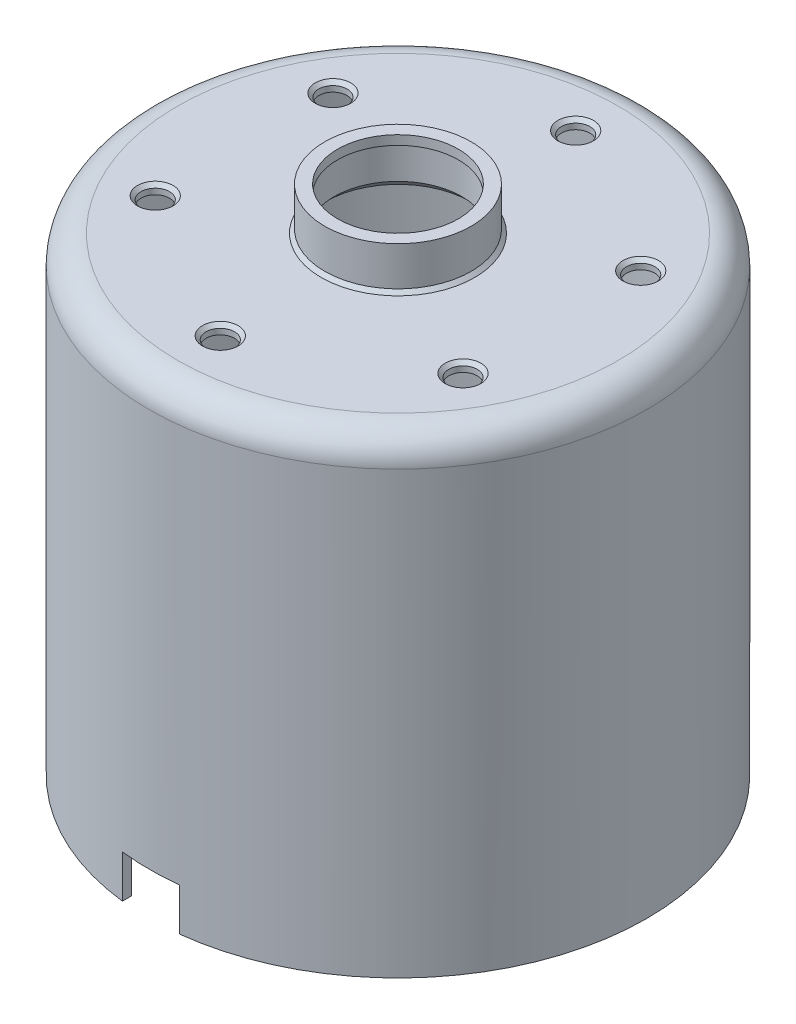
ISO-10303-21;
HEADER;
FILE_DESCRIPTION(('STEP AP214'),'2;1');
FILE_NAME('part.step','',(''),(''),'','','');
FILE_SCHEMA(('AUTOMOTIVE_DESIGN { 1 0 10303 214 1 1 1 1 }'));
ENDSEC;
DATA;
#1=APPLICATION_CONTEXT('core data for automotive mechanical design processes');
#2=APPLICATION_PROTOCOL_DEFINITION('international standard','automotive_design',2000,#1);
#3=PRODUCT_CONTEXT('',#1,'mechanical');
#4=PRODUCT('Part','Part','',(#3));
#5=PRODUCT_RELATED_PRODUCT_CATEGORY('part','',(#4));
#6=PRODUCT_DEFINITION_FORMATION('','',#4);
#7=PRODUCT_DEFINITION_CONTEXT('part definition',#1,'design');
#8=PRODUCT_DEFINITION('design','',#6,#7);
#9=PRODUCT_DEFINITION_SHAPE('','',#8);
#10=(LENGTH_UNIT() NAMED_UNIT(*) SI_UNIT(.MILLI.,.METRE.));
#11=(NAMED_UNIT(*) PLANE_ANGLE_UNIT() SI_UNIT($,.RADIAN.));
#12=(NAMED_UNIT(*) SI_UNIT($,.STERADIAN.) SOLID_ANGLE_UNIT());
#13=UNCERTAINTY_MEASURE_WITH_UNIT(LENGTH_MEASURE(1.E-05),#10,'distance_accuracy_value','');
#14=(GEOMETRIC_REPRESENTATION_CONTEXT(3) GLOBAL_UNCERTAINTY_ASSIGNED_CONTEXT((#13)) GLOBAL_UNIT_ASSIGNED_CONTEXT((#10,
#11,#12)) REPRESENTATION_CONTEXT('',''));
#15=CARTESIAN_POINT('',(0.,0.,0.));
#16=DIRECTION('',(0.,0.,1.));
#17=DIRECTION('',(1.,0.,0.));
#18=AXIS2_PLACEMENT_3D('',#15,#16,#17);
#19=CARTESIAN_POINT('',(0.,33.,0.));
#20=DIRECTION('',(0.,-1.,0.));
#21=DIRECTION('',(0.,0.,-1.));
#22=AXIS2_PLACEMENT_3D('',#19,#20,#21);
#23=CYLINDRICAL_SURFACE('',#22,17.5);
#24=CARTESIAN_POINT('',(0.,31.,0.));
#25=DIRECTION('',(0.,1.,0.));
#26=DIRECTION('',(0.,0.,1.));
#27=AXIS2_PLACEMENT_3D('',#24,#25,#26);
#28=CIRCLE('',#27,17.5);
#29=CARTESIAN_POINT('',(0.,31.,17.5));
#30=VERTEX_POINT('',#29);
#31=EDGE_CURVE('E128',#30,#30,#28,.F.);
#32=ORIENTED_EDGE('',*,*,#31,.T.);
#33=EDGE_LOOP('',(#32));
#34=FACE_BOUND('',#33,.T.);
#35=CARTESIAN_POINT('',(0.,0.,0.));
#36=DIRECTION('',(0.,1.,0.));
#37=DIRECTION('',(0.,0.,1.));
#38=AXIS2_PLACEMENT_3D('',#35,#36,#37);
#39=CIRCLE('',#38,17.5);
#40=CARTESIAN_POINT('',(2.,0.,17.3853386507137));
#41=VERTEX_POINT('',#40);
#42=CARTESIAN_POINT('',(-2.,0.,17.3853386507137));
#43=VERTEX_POINT('',#42);
#44=EDGE_CURVE('E94',#41,#43,#39,.T.);
#45=ORIENTED_EDGE('',*,*,#44,.T.);
#46=DIRECTION('',(0.,-1.,0.));
#47=VECTOR('',#46,1.);
#48=CARTESIAN_POINT('',(-2.,33.,17.3853386507137));
#49=LINE('',#48,#47);
#50=CARTESIAN_POINT('',(-2.,3.,17.3853386507137));
#51=VERTEX_POINT('',#50);
#52=EDGE_CURVE('E553',#51,#43,#49,.T.);
#53=ORIENTED_EDGE('',*,*,#52,.F.);
#54=CARTESIAN_POINT('',(0.,3.,0.));
#55=DIRECTION('',(0.,1.,0.));
#56=DIRECTION('',(0.,0.,1.));
#57=AXIS2_PLACEMENT_3D('',#54,#55,#56);
#58=CIRCLE('',#57,17.5);
#59=CARTESIAN_POINT('',(2.,3.,17.3853386507137));
#60=VERTEX_POINT('',#59);
#61=EDGE_CURVE('E556',#60,#51,#58,.F.);
#62=ORIENTED_EDGE('',*,*,#61,.F.);
#63=DIRECTION('',(0.,-1.,0.));
#64=VECTOR('',#63,1.);
#65=CARTESIAN_POINT('',(2.,33.,17.3853386507137));
#66=LINE('',#65,#64);
#67=EDGE_CURVE('E96',#41,#60,#66,.F.);
#68=ORIENTED_EDGE('',*,*,#67,.F.);
#69=EDGE_LOOP('',(#45,#53,#62,#68));
#70=FACE_BOUND('',#69,.T.);
#71=ADVANCED_FACE('F36',(#34,#70),#23,.T.);
#72=CARTESIAN_POINT('',(0.,33.,0.));
#73=DIRECTION('',(0.,1.,0.));
#74=DIRECTION('',(0.,0.,1.));
#75=AXIS2_PLACEMENT_3D('',#72,#73,#74);
#76=PLANE('',#75);
#77=CARTESIAN_POINT('',(10.8253175473054,33.,-6.25000000000013));
#78=DIRECTION('',(0.,1.,0.));
#79=DIRECTION('',(0.,0.,1.));
#80=AXIS2_PLACEMENT_3D('',#77,#78,#79);
#81=CIRCLE('',#80,1.25);
#82=CARTESIAN_POINT('',(10.8253175473054,33.,-5.00000000000013));
#83=VERTEX_POINT('',#82);
#84=EDGE_CURVE('E11',#83,#83,#81,.F.);
#85=ORIENTED_EDGE('',*,*,#84,.T.);
#86=EDGE_LOOP('',(#85));
#87=FACE_BOUND('',#86,.T.);
#88=CARTESIAN_POINT('',(10.8253175473055,33.,6.2499999999999));
#89=DIRECTION('',(0.,1.,0.));
#90=DIRECTION('',(0.,0.,1.));
#91=AXIS2_PLACEMENT_3D('',#88,#89,#90);
#92=CIRCLE('',#91,1.25000000000002);
#93=CARTESIAN_POINT('',(10.8253175473055,33.,7.49999999999992));
#94=VERTEX_POINT('',#93);
#95=EDGE_CURVE('E174',#94,#94,#92,.F.);
#96=ORIENTED_EDGE('',*,*,#95,.T.);
#97=EDGE_LOOP('',(#96));
#98=FACE_BOUND('',#97,.T.);
#99=CARTESIAN_POINT('',(0.,33.,12.5));
#100=DIRECTION('',(0.,1.,0.));
#101=DIRECTION('',(0.,0.,1.));
#102=AXIS2_PLACEMENT_3D('',#99,#100,#101);
#103=CIRCLE('',#102,1.24999999999999);
#104=CARTESIAN_POINT('',(0.,33.,13.75));
#105=VERTEX_POINT('',#104);
#106=EDGE_CURVE('E166',#105,#105,#103,.F.);
#107=ORIENTED_EDGE('',*,*,#106,.T.);
#108=EDGE_LOOP('',(#107));
#109=FACE_BOUND('',#108,.T.);
#110=CARTESIAN_POINT('',(-10.8253175473055,33.,6.25000000000005));
#111=DIRECTION('',(0.,1.,0.));
#112=DIRECTION('',(0.,0.,1.));
#113=AXIS2_PLACEMENT_3D('',#110,#111,#112);
#114=CIRCLE('',#113,1.25);
#115=CARTESIAN_POINT('',(-10.8253175473055,33.,7.50000000000005));
#116=VERTEX_POINT('',#115);
#117=EDGE_CURVE('E159',#116,#116,#114,.F.);
#118=ORIENTED_EDGE('',*,*,#117,.T.);
#119=EDGE_LOOP('',(#118));
#120=FACE_BOUND('',#119,.T.);
#121=CARTESIAN_POINT('',(-10.8253175473055,33.,-6.24999999999998));
#122=DIRECTION('',(0.,1.,0.));
#123=DIRECTION('',(0.,0.,1.));
#124=AXIS2_PLACEMENT_3D('',#121,#122,#123);
#125=CIRCLE('',#124,1.25000000000002);
#126=CARTESIAN_POINT('',(-10.8253175473055,33.,-4.99999999999996));
#127=VERTEX_POINT('',#126);
#128=EDGE_CURVE('E151',#127,#127,#125,.F.);
#129=ORIENTED_EDGE('',*,*,#128,.T.);
#130=EDGE_LOOP('',(#129));
#131=FACE_BOUND('',#130,.T.);
#132=CARTESIAN_POINT('',(0.,33.,-12.5));
#133=DIRECTION('',(0.,1.,0.));
#134=DIRECTION('',(0.,0.,1.));
#135=AXIS2_PLACEMENT_3D('',#132,#133,#134);
#136=CIRCLE('',#135,1.24999999999999);
#137=CARTESIAN_POINT('',(0.,33.,-11.25));
#138=VERTEX_POINT('',#137);
#139=EDGE_CURVE('E143',#138,#138,#136,.F.);
#140=ORIENTED_EDGE('',*,*,#139,.T.);
#141=EDGE_LOOP('',(#140));
#142=FACE_BOUND('',#141,.T.);
#143=CARTESIAN_POINT('',(0.,33.,0.));
#144=DIRECTION('',(0.,1.,0.));
#145=DIRECTION('',(0.,0.,1.));
#146=AXIS2_PLACEMENT_3D('',#143,#144,#145);
#147=CIRCLE('',#146,5.40000000000001);
#148=CARTESIAN_POINT('',(0.,33.,5.40000000000001));
#149=VERTEX_POINT('',#148);
#150=EDGE_CURVE('E135',#149,#149,#147,.F.);
#151=ORIENTED_EDGE('',*,*,#150,.T.);
#152=EDGE_LOOP('',(#151));
#153=FACE_BOUND('',#152,.T.);
#154=CARTESIAN_POINT('',(0.,33.,0.));
#155=DIRECTION('',(0.,1.,0.));
#156=DIRECTION('',(0.,0.,1.));
#157=AXIS2_PLACEMENT_3D('',#154,#155,#156);
#158=CIRCLE('',#157,15.5);
#159=CARTESIAN_POINT('',(0.,33.,15.5));
#160=VERTEX_POINT('',#159);
#161=EDGE_CURVE('E124',#160,#160,#158,.T.);
#162=ORIENTED_EDGE('',*,*,#161,.T.);
#163=EDGE_LOOP('',(#162));
#164=FACE_BOUND('',#163,.T.);
#165=ADVANCED_FACE('F199',(#87,#98,#109,#120,#131,#142,#153,#164),#76,.T.);
#166=CARTESIAN_POINT('',(0.,0.,0.));
#167=DIRECTION('',(0.,1.,0.));
#168=DIRECTION('',(0.,0.,1.));
#169=AXIS2_PLACEMENT_3D('',#166,#167,#168);
#170=PLANE('',#169);
#171=CARTESIAN_POINT('',(0.,0.,0.));
#172=DIRECTION('',(0.,1.,0.));
#173=DIRECTION('',(0.,0.,1.));
#174=AXIS2_PLACEMENT_3D('',#171,#172,#173);
#175=CIRCLE('',#174,16.85);
#176=CARTESIAN_POINT('',(2.,0.,16.7308846149867));
#177=VERTEX_POINT('',#176);
#178=CARTESIAN_POINT('',(-2.,0.,16.7308846149867));
#179=VERTEX_POINT('',#178);
#180=EDGE_CURVE('E92',#177,#179,#175,.T.);
#181=ORIENTED_EDGE('',*,*,#180,.T.);
#182=DIRECTION('',(0.,0.,-1.));
#183=VECTOR('',#182,1.);
#184=CARTESIAN_POINT('',(-2.,0.,-17.501));
#185=LINE('',#184,#183);
#186=EDGE_CURVE('E97',#43,#179,#185,.T.);
#187=ORIENTED_EDGE('',*,*,#186,.F.);
#188=ORIENTED_EDGE('',*,*,#44,.F.);
#189=DIRECTION('',(0.,0.,1.));
#190=VECTOR('',#189,1.);
#191=CARTESIAN_POINT('',(2.,0.,-17.501));
#192=LINE('',#191,#190);
#193=EDGE_CURVE('E80',#177,#41,#192,.T.);
#194=ORIENTED_EDGE('',*,*,#193,.F.);
#195=EDGE_LOOP('',(#181,#187,#188,#194));
#196=FACE_BOUND('',#195,.T.);
#197=ADVANCED_FACE('F90',(#196),#170,.F.);
#198=CARTESIAN_POINT('',(0.,31.,0.));
#199=DIRECTION('',(0.,1.,0.));
#200=DIRECTION('',(0.,0.,1.));
#201=AXIS2_PLACEMENT_3D('',#198,#199,#200);
#202=TOROIDAL_SURFACE('',#201,15.5,2.);
#203=ORIENTED_EDGE('',*,*,#31,.F.);
#204=EDGE_LOOP('',(#203));
#205=FACE_BOUND('',#204,.T.);
#206=ORIENTED_EDGE('',*,*,#161,.F.);
#207=EDGE_LOOP('',(#206));
#208=FACE_BOUND('',#207,.T.);
#209=ADVANCED_FACE('F210',(#205,#208),#202,.T.);
#210=CARTESIAN_POINT('',(0.,36.,0.));
#211=DIRECTION('',(0.,-1.,0.));
#212=DIRECTION('',(0.,0.,-1.));
#213=AXIS2_PLACEMENT_3D('',#210,#211,#212);
#214=CYLINDRICAL_SURFACE('',#213,5.15);
#215=CARTESIAN_POINT('',(0.,33.25,0.));
#216=DIRECTION('',(0.,1.,0.));
#217=DIRECTION('',(0.,0.,1.));
#218=AXIS2_PLACEMENT_3D('',#215,#216,#217);
#219=CIRCLE('',#218,5.15);
#220=CARTESIAN_POINT('',(0.,33.25,5.15));
#221=VERTEX_POINT('',#220);
#222=EDGE_CURVE('E132',#221,#221,#219,.T.);
#223=ORIENTED_EDGE('',*,*,#222,.T.);
#224=EDGE_LOOP('',(#223));
#225=FACE_BOUND('',#224,.T.);
#226=CARTESIAN_POINT('',(0.,36.,0.));
#227=DIRECTION('',(0.,1.,0.));
#228=DIRECTION('',(0.,0.,1.));
#229=AXIS2_PLACEMENT_3D('',#226,#227,#228);
#230=CIRCLE('',#229,5.15);
#231=CARTESIAN_POINT('',(0.,36.,5.15));
#232=VERTEX_POINT('',#231);
#233=EDGE_CURVE('E117',#232,#232,#230,.T.);
#234=ORIENTED_EDGE('',*,*,#233,.F.);
#235=EDGE_LOOP('',(#234));
#236=FACE_BOUND('',#235,.T.);
#237=ADVANCED_FACE('F213',(#225,#236),#214,.T.);
#238=CARTESIAN_POINT('',(0.,36.,0.));
#239=DIRECTION('',(0.,1.,0.));
#240=DIRECTION('',(0.,0.,1.));
#241=AXIS2_PLACEMENT_3D('',#238,#239,#240);
#242=PLANE('',#241);
#243=CARTESIAN_POINT('',(0.,36.,0.));
#244=DIRECTION('',(0.,1.,0.));
#245=DIRECTION('',(0.,0.,1.));
#246=AXIS2_PLACEMENT_3D('',#243,#244,#245);
#247=CIRCLE('',#246,4.25);
#248=CARTESIAN_POINT('',(0.,36.,4.25));
#249=VERTEX_POINT('',#248);
#250=EDGE_CURVE('E278',#249,#249,#247,.T.);
#251=ORIENTED_EDGE('',*,*,#250,.F.);
#252=EDGE_LOOP('',(#251));
#253=FACE_BOUND('',#252,.T.);
#254=ORIENTED_EDGE('',*,*,#233,.T.);
#255=EDGE_LOOP('',(#254));
#256=FACE_BOUND('',#255,.T.);
#257=ADVANCED_FACE('F218',(#253,#256),#242,.T.);
#258=CARTESIAN_POINT('',(0.,33.25,0.));
#259=DIRECTION('',(0.,-1.,0.));
#260=DIRECTION('',(0.,0.,-1.));
#261=AXIS2_PLACEMENT_3D('',#258,#259,#260);
#262=CONICAL_SURFACE('',#261,5.15,0.785398163397436);
#263=ORIENTED_EDGE('',*,*,#150,.F.);
#264=EDGE_LOOP('',(#263));
#265=FACE_BOUND('',#264,.T.);
#266=ORIENTED_EDGE('',*,*,#222,.F.);
#267=EDGE_LOOP('',(#266));
#268=FACE_BOUND('',#267,.T.);
#269=ADVANCED_FACE('F215',(#265,#268),#262,.T.);
#270=CARTESIAN_POINT('',(0.,33.,0.));
#271=DIRECTION('',(0.,-1.,0.));
#272=DIRECTION('',(0.,0.,-1.));
#273=AXIS2_PLACEMENT_3D('',#270,#271,#272);
#274=CYLINDRICAL_SURFACE('',#273,16.85);
#275=DIRECTION('',(0.,-1.,0.));
#276=VECTOR('',#275,1.);
#277=CARTESIAN_POINT('',(-2.,33.,16.7308846149867));
#278=LINE('',#277,#276);
#279=CARTESIAN_POINT('',(-2.,3.,16.7308846149867));
#280=VERTEX_POINT('',#279);
#281=EDGE_CURVE('E60',#280,#179,#278,.T.);
#282=ORIENTED_EDGE('',*,*,#281,.T.);
#283=ORIENTED_EDGE('',*,*,#180,.F.);
#284=DIRECTION('',(0.,-1.,0.));
#285=VECTOR('',#284,1.);
#286=CARTESIAN_POINT('',(2.,33.,16.7308846149867));
#287=LINE('',#286,#285);
#288=CARTESIAN_POINT('',(2.,3.,16.7308846149867));
#289=VERTEX_POINT('',#288);
#290=EDGE_CURVE('E77',#177,#289,#287,.F.);
#291=ORIENTED_EDGE('',*,*,#290,.T.);
#292=CARTESIAN_POINT('',(0.,3.,0.));
#293=DIRECTION('',(0.,1.,0.));
#294=DIRECTION('',(0.,0.,1.));
#295=AXIS2_PLACEMENT_3D('',#292,#293,#294);
#296=CIRCLE('',#295,16.85);
#297=EDGE_CURVE('E270',#289,#280,#296,.F.);
#298=ORIENTED_EDGE('',*,*,#297,.T.);
#299=EDGE_LOOP('',(#282,#283,#291,#298));
#300=FACE_BOUND('',#299,.T.);
#301=CARTESIAN_POINT('',(0.,31.,0.));
#302=DIRECTION('',(0.,-1.,0.));
#303=DIRECTION('',(0.,0.,-1.));
#304=AXIS2_PLACEMENT_3D('',#301,#302,#303);
#305=CIRCLE('',#304,16.85);
#306=CARTESIAN_POINT('',(0.,31.,-16.85));
#307=VERTEX_POINT('',#306);
#308=EDGE_CURVE('E109',#307,#307,#305,.T.);
#309=ORIENTED_EDGE('',*,*,#308,.F.);
#310=EDGE_LOOP('',(#309));
#311=FACE_BOUND('',#310,.T.);
#312=ADVANCED_FACE('F99',(#300,#311),#274,.F.);
#313=CARTESIAN_POINT('',(0.,32.35,0.));
#314=DIRECTION('',(0.,1.,0.));
#315=DIRECTION('',(0.,0.,1.));
#316=AXIS2_PLACEMENT_3D('',#313,#314,#315);
#317=PLANE('',#316);
#318=CARTESIAN_POINT('',(10.8253175473054,32.35,-6.25000000000013));
#319=DIRECTION('',(0.,1.,0.));
#320=DIRECTION('',(0.,0.,1.));
#321=AXIS2_PLACEMENT_3D('',#318,#319,#320);
#322=CIRCLE('',#321,1.);
#323=CARTESIAN_POINT('',(10.8253175473054,32.35,-5.25000000000013));
#324=VERTEX_POINT('',#323);
#325=EDGE_CURVE('E263',#324,#324,#322,.F.);
#326=ORIENTED_EDGE('',*,*,#325,.F.);
#327=EDGE_LOOP('',(#326));
#328=FACE_BOUND('',#327,.T.);
#329=CARTESIAN_POINT('',(10.8253175473055,32.35,6.2499999999999));
#330=DIRECTION('',(0.,1.,0.));
#331=DIRECTION('',(0.,0.,1.));
#332=AXIS2_PLACEMENT_3D('',#329,#330,#331);
#333=CIRCLE('',#332,1.);
#334=CARTESIAN_POINT('',(10.8253175473055,32.35,7.2499999999999));
#335=VERTEX_POINT('',#334);
#336=EDGE_CURVE('E254',#335,#335,#333,.F.);
#337=ORIENTED_EDGE('',*,*,#336,.F.);
#338=EDGE_LOOP('',(#337));
#339=FACE_BOUND('',#338,.T.);
#340=CARTESIAN_POINT('',(0.,32.35,12.5));
#341=DIRECTION('',(0.,1.,0.));
#342=DIRECTION('',(0.,0.,1.));
#343=AXIS2_PLACEMENT_3D('',#340,#341,#342);
#344=CIRCLE('',#343,1.);
#345=CARTESIAN_POINT('',(0.,32.35,13.5));
#346=VERTEX_POINT('',#345);
#347=EDGE_CURVE('E250',#346,#346,#344,.F.);
#348=ORIENTED_EDGE('',*,*,#347,.F.);
#349=EDGE_LOOP('',(#348));
#350=FACE_BOUND('',#349,.T.);
#351=CARTESIAN_POINT('',(-10.8253175473055,32.35,6.25000000000005));
#352=DIRECTION('',(0.,1.,0.));
#353=DIRECTION('',(0.,0.,1.));
#354=AXIS2_PLACEMENT_3D('',#351,#352,#353);
#355=CIRCLE('',#354,1.);
#356=CARTESIAN_POINT('',(-10.8253175473055,32.35,7.25000000000005));
#357=VERTEX_POINT('',#356);
#358=EDGE_CURVE('E253',#357,#357,#355,.F.);
#359=ORIENTED_EDGE('',*,*,#358,.F.);
#360=EDGE_LOOP('',(#359));
#361=FACE_BOUND('',#360,.T.);
#362=CARTESIAN_POINT('',(-10.8253175473055,32.35,-6.24999999999998));
#363=DIRECTION('',(0.,1.,0.));
#364=DIRECTION('',(0.,0.,1.));
#365=AXIS2_PLACEMENT_3D('',#362,#363,#364);
#366=CIRCLE('',#365,1.);
#367=CARTESIAN_POINT('',(-10.8253175473055,32.35,-5.24999999999998));
#368=VERTEX_POINT('',#367);
#369=EDGE_CURVE('E259',#368,#368,#366,.F.);
#370=ORIENTED_EDGE('',*,*,#369,.F.);
#371=EDGE_LOOP('',(#370));
#372=FACE_BOUND('',#371,.T.);
#373=CARTESIAN_POINT('',(0.,32.35,-12.5));
#374=DIRECTION('',(0.,1.,0.));
#375=DIRECTION('',(0.,0.,1.));
#376=AXIS2_PLACEMENT_3D('',#373,#374,#375);
#377=CIRCLE('',#376,1.);
#378=CARTESIAN_POINT('',(0.,32.35,-11.5));
#379=VERTEX_POINT('',#378);
#380=EDGE_CURVE('E274',#379,#379,#377,.F.);
#381=ORIENTED_EDGE('',*,*,#380,.F.);
#382=EDGE_LOOP('',(#381));
#383=FACE_BOUND('',#382,.T.);
#384=CARTESIAN_POINT('',(0.,32.35,0.));
#385=DIRECTION('',(0.,1.,0.));
#386=DIRECTION('',(0.,0.,1.));
#387=AXIS2_PLACEMENT_3D('',#384,#385,#386);
#388=CIRCLE('',#387,5.13076118445749);
#389=CARTESIAN_POINT('',(0.,32.35,5.13076118445749));
#390=VERTEX_POINT('',#389);
#391=EDGE_CURVE('E121',#390,#390,#388,.F.);
#392=ORIENTED_EDGE('',*,*,#391,.F.);
#393=EDGE_LOOP('',(#392));
#394=FACE_BOUND('',#393,.T.);
#395=CARTESIAN_POINT('',(0.,32.35,0.));
#396=DIRECTION('',(0.,1.,0.));
#397=DIRECTION('',(0.,0.,1.));
#398=AXIS2_PLACEMENT_3D('',#395,#396,#397);
#399=CIRCLE('',#398,15.5);
#400=CARTESIAN_POINT('',(0.,32.35,15.5));
#401=VERTEX_POINT('',#400);
#402=EDGE_CURVE('E102',#401,#401,#399,.T.);
#403=ORIENTED_EDGE('',*,*,#402,.F.);
#404=EDGE_LOOP('',(#403));
#405=FACE_BOUND('',#404,.T.);
#406=ADVANCED_FACE('F343',(#328,#339,#350,#361,#372,#383,#394,#405),#317,.F.);
#407=CARTESIAN_POINT('',(0.,31.,0.));
#408=DIRECTION('',(0.,1.,0.));
#409=DIRECTION('',(0.,0.,1.));
#410=AXIS2_PLACEMENT_3D('',#407,#408,#409);
#411=TOROIDAL_SURFACE('',#410,15.5,1.35);
#412=ORIENTED_EDGE('',*,*,#308,.T.);
#413=EDGE_LOOP('',(#412));
#414=FACE_BOUND('',#413,.T.);
#415=ORIENTED_EDGE('',*,*,#402,.T.);
#416=EDGE_LOOP('',(#415));
#417=FACE_BOUND('',#416,.T.);
#418=ADVANCED_FACE('F301',(#414,#417),#411,.F.);
#419=CARTESIAN_POINT('',(0.,36.,0.));
#420=DIRECTION('',(0.,-1.,0.));
#421=DIRECTION('',(0.,0.,-1.));
#422=AXIS2_PLACEMENT_3D('',#419,#420,#421);
#423=CYLINDRICAL_SURFACE('',#422,4.5);
#424=CARTESIAN_POINT('',(0.,32.9807611844575,0.));
#425=DIRECTION('',(0.,-1.,0.));
#426=DIRECTION('',(0.,0.,-1.));
#427=AXIS2_PLACEMENT_3D('',#424,#425,#426);
#428=CIRCLE('',#427,4.5);
#429=CARTESIAN_POINT('',(0.,32.9807611844575,-4.5));
#430=VERTEX_POINT('',#429);
#431=EDGE_CURVE('E287',#430,#430,#428,.F.);
#432=ORIENTED_EDGE('',*,*,#431,.F.);
#433=EDGE_LOOP('',(#432));
#434=FACE_BOUND('',#433,.T.);
#435=CARTESIAN_POINT('',(0.,35.35,0.));
#436=DIRECTION('',(0.,1.,0.));
#437=DIRECTION('',(0.,0.,1.));
#438=AXIS2_PLACEMENT_3D('',#435,#436,#437);
#439=CIRCLE('',#438,4.5);
#440=CARTESIAN_POINT('',(0.,35.35,4.5));
#441=VERTEX_POINT('',#440);
#442=EDGE_CURVE('E103',#441,#441,#439,.T.);
#443=ORIENTED_EDGE('',*,*,#442,.T.);
#444=EDGE_LOOP('',(#443));
#445=FACE_BOUND('',#444,.T.);
#446=ADVANCED_FACE('F297',(#434,#445),#423,.F.);
#447=CARTESIAN_POINT('',(0.,35.35,0.));
#448=DIRECTION('',(0.,1.,0.));
#449=DIRECTION('',(0.,0.,1.));
#450=AXIS2_PLACEMENT_3D('',#447,#448,#449);
#451=PLANE('',#450);
#452=CARTESIAN_POINT('',(0.,35.35,0.));
#453=DIRECTION('',(0.,1.,0.));
#454=DIRECTION('',(0.,0.,1.));
#455=AXIS2_PLACEMENT_3D('',#452,#453,#454);
#456=CIRCLE('',#455,4.25);
#457=CARTESIAN_POINT('',(0.,35.35,4.25));
#458=VERTEX_POINT('',#457);
#459=EDGE_CURVE('E113',#458,#458,#456,.F.);
#460=ORIENTED_EDGE('',*,*,#459,.F.);
#461=EDGE_LOOP('',(#460));
#462=FACE_BOUND('',#461,.T.);
#463=ORIENTED_EDGE('',*,*,#442,.F.);
#464=EDGE_LOOP('',(#463));
#465=FACE_BOUND('',#464,.T.);
#466=ADVANCED_FACE('F300',(#462,#465),#451,.F.);
#467=CARTESIAN_POINT('',(0.,32.7903805922288,0.));
#468=DIRECTION('',(0.,-1.,0.));
#469=DIRECTION('',(0.,0.,-1.));
#470=AXIS2_PLACEMENT_3D('',#467,#468,#469);
#471=CONICAL_SURFACE('',#470,4.69038059222874,0.785398163397436);
#472=ORIENTED_EDGE('',*,*,#391,.T.);
#473=EDGE_LOOP('',(#472));
#474=FACE_BOUND('',#473,.T.);
#475=ORIENTED_EDGE('',*,*,#431,.T.);
#476=EDGE_LOOP('',(#475));
#477=FACE_BOUND('',#476,.T.);
#478=ADVANCED_FACE('F295',(#474,#477),#471,.F.);
#479=CARTESIAN_POINT('',(0.,-0.001000000000001,0.));
#480=DIRECTION('',(0.,1.,0.));
#481=DIRECTION('',(0.,0.,1.));
#482=AXIS2_PLACEMENT_3D('',#479,#480,#481);
#483=CYLINDRICAL_SURFACE('',#482,4.25);
#484=ORIENTED_EDGE('',*,*,#250,.T.);
#485=EDGE_LOOP('',(#484));
#486=FACE_BOUND('',#485,.T.);
#487=ORIENTED_EDGE('',*,*,#459,.T.);
#488=EDGE_LOOP('',(#487));
#489=FACE_BOUND('',#488,.T.);
#490=ADVANCED_FACE('F311',(#486,#489),#483,.F.);
#491=CARTESIAN_POINT('',(0.,-0.001000000000001,-12.5));
#492=DIRECTION('',(0.,1.,0.));
#493=DIRECTION('',(0.,0.,1.));
#494=AXIS2_PLACEMENT_3D('',#491,#492,#493);
#495=CYLINDRICAL_SURFACE('',#494,1.);
#496=CARTESIAN_POINT('',(0.,32.75,-12.5));
#497=DIRECTION('',(0.,1.,0.));
#498=DIRECTION('',(0.,0.,1.));
#499=AXIS2_PLACEMENT_3D('',#496,#497,#498);
#500=CIRCLE('',#499,1.);
#501=CARTESIAN_POINT('',(0.,32.75,-11.5));
#502=VERTEX_POINT('',#501);
#503=EDGE_CURVE('E139',#502,#502,#500,.T.);
#504=ORIENTED_EDGE('',*,*,#503,.T.);
#505=EDGE_LOOP('',(#504));
#506=FACE_BOUND('',#505,.T.);
#507=ORIENTED_EDGE('',*,*,#380,.T.);
#508=EDGE_LOOP('',(#507));
#509=FACE_BOUND('',#508,.T.);
#510=ADVANCED_FACE('F224',(#506,#509),#495,.F.);
#511=CARTESIAN_POINT('',(0.,32.75,-12.5));
#512=DIRECTION('',(0.,1.,0.));
#513=DIRECTION('',(0.,0.,1.));
#514=AXIS2_PLACEMENT_3D('',#511,#512,#513);
#515=CONICAL_SURFACE('',#514,1.,0.785398163397422);
#516=ORIENTED_EDGE('',*,*,#139,.F.);
#517=EDGE_LOOP('',(#516));
#518=FACE_BOUND('',#517,.T.);
#519=ORIENTED_EDGE('',*,*,#503,.F.);
#520=EDGE_LOOP('',(#519));
#521=FACE_BOUND('',#520,.T.);
#522=ADVANCED_FACE('F220',(#518,#521),#515,.F.);
#523=CARTESIAN_POINT('',(-10.8253175473055,-0.001000000000001,-6.24999999999998));
#524=DIRECTION('',(0.,1.,0.));
#525=DIRECTION('',(0.,0.,1.));
#526=AXIS2_PLACEMENT_3D('',#523,#524,#525);
#527=CYLINDRICAL_SURFACE('',#526,1.);
#528=CARTESIAN_POINT('',(-10.8253175473055,32.75,-6.24999999999998));
#529=DIRECTION('',(0.,1.,0.));
#530=DIRECTION('',(0.,0.,1.));
#531=AXIS2_PLACEMENT_3D('',#528,#529,#530);
#532=CIRCLE('',#531,1.);
#533=CARTESIAN_POINT('',(-10.8253175473055,32.75,-5.24999999999998));
#534=VERTEX_POINT('',#533);
#535=EDGE_CURVE('E147',#534,#534,#532,.T.);
#536=ORIENTED_EDGE('',*,*,#535,.T.);
#537=EDGE_LOOP('',(#536));
#538=FACE_BOUND('',#537,.T.);
#539=ORIENTED_EDGE('',*,*,#369,.T.);
#540=EDGE_LOOP('',(#539));
#541=FACE_BOUND('',#540,.T.);
#542=ADVANCED_FACE('F223',(#538,#541),#527,.F.);
#543=CARTESIAN_POINT('',(-10.8253175473055,-0.001000000000001,6.25000000000005));
#544=DIRECTION('',(0.,1.,0.));
#545=DIRECTION('',(0.,0.,1.));
#546=AXIS2_PLACEMENT_3D('',#543,#544,#545);
#547=CYLINDRICAL_SURFACE('',#546,1.);
#548=CARTESIAN_POINT('',(-10.8253175473055,32.75,6.25000000000005));
#549=DIRECTION('',(0.,1.,0.));
#550=DIRECTION('',(0.,0.,1.));
#551=AXIS2_PLACEMENT_3D('',#548,#549,#550);
#552=CIRCLE('',#551,1.);
#553=CARTESIAN_POINT('',(-10.8253175473055,32.75,7.25000000000005));
#554=VERTEX_POINT('',#553);
#555=EDGE_CURVE('E155',#554,#554,#552,.T.);
#556=ORIENTED_EDGE('',*,*,#555,.T.);
#557=EDGE_LOOP('',(#556));
#558=FACE_BOUND('',#557,.T.);
#559=ORIENTED_EDGE('',*,*,#358,.T.);
#560=EDGE_LOOP('',(#559));
#561=FACE_BOUND('',#560,.T.);
#562=ADVANCED_FACE('F246',(#558,#561),#547,.F.);
#563=CARTESIAN_POINT('',(0.,-0.001000000000001,12.5));
#564=DIRECTION('',(0.,1.,0.));
#565=DIRECTION('',(0.,0.,1.));
#566=AXIS2_PLACEMENT_3D('',#563,#564,#565);
#567=CYLINDRICAL_SURFACE('',#566,1.);
#568=CARTESIAN_POINT('',(0.,32.75,12.5));
#569=DIRECTION('',(0.,1.,0.));
#570=DIRECTION('',(0.,0.,1.));
#571=AXIS2_PLACEMENT_3D('',#568,#569,#570);
#572=CIRCLE('',#571,1.);
#573=CARTESIAN_POINT('',(0.,32.75,13.5));
#574=VERTEX_POINT('',#573);
#575=EDGE_CURVE('E163',#574,#574,#572,.T.);
#576=ORIENTED_EDGE('',*,*,#575,.T.);
#577=EDGE_LOOP('',(#576));
#578=FACE_BOUND('',#577,.T.);
#579=ORIENTED_EDGE('',*,*,#347,.T.);
#580=EDGE_LOOP('',(#579));
#581=FACE_BOUND('',#580,.T.);
#582=ADVANCED_FACE('F242',(#578,#581),#567,.F.);
#583=CARTESIAN_POINT('',(10.8253175473055,-0.001000000000001,6.2499999999999));
#584=DIRECTION('',(0.,1.,0.));
#585=DIRECTION('',(0.,0.,1.));
#586=AXIS2_PLACEMENT_3D('',#583,#584,#585);
#587=CYLINDRICAL_SURFACE('',#586,1.);
#588=CARTESIAN_POINT('',(10.8253175473055,32.75,6.2499999999999));
#589=DIRECTION('',(0.,1.,0.));
#590=DIRECTION('',(0.,0.,1.));
#591=AXIS2_PLACEMENT_3D('',#588,#589,#590);
#592=CIRCLE('',#591,1.);
#593=CARTESIAN_POINT('',(10.8253175473055,32.75,7.2499999999999));
#594=VERTEX_POINT('',#593);
#595=EDGE_CURVE('E170',#594,#594,#592,.T.);
#596=ORIENTED_EDGE('',*,*,#595,.T.);
#597=EDGE_LOOP('',(#596));
#598=FACE_BOUND('',#597,.T.);
#599=ORIENTED_EDGE('',*,*,#336,.T.);
#600=EDGE_LOOP('',(#599));
#601=FACE_BOUND('',#600,.T.);
#602=ADVANCED_FACE('F245',(#598,#601),#587,.F.);
#603=CARTESIAN_POINT('',(10.8253175473054,-0.001000000000001,-6.25000000000013));
#604=DIRECTION('',(0.,1.,0.));
#605=DIRECTION('',(0.,0.,1.));
#606=AXIS2_PLACEMENT_3D('',#603,#604,#605);
#607=CYLINDRICAL_SURFACE('',#606,1.);
#608=CARTESIAN_POINT('',(10.8253175473054,32.75,-6.25000000000013));
#609=DIRECTION('',(0.,1.,0.));
#610=DIRECTION('',(0.,0.,1.));
#611=AXIS2_PLACEMENT_3D('',#608,#609,#610);
#612=CIRCLE('',#611,1.);
#613=CARTESIAN_POINT('',(10.8253175473054,32.75,-5.25000000000013));
#614=VERTEX_POINT('',#613);
#615=EDGE_CURVE('E45',#614,#614,#612,.T.);
#616=ORIENTED_EDGE('',*,*,#615,.T.);
#617=EDGE_LOOP('',(#616));
#618=FACE_BOUND('',#617,.T.);
#619=ORIENTED_EDGE('',*,*,#325,.T.);
#620=EDGE_LOOP('',(#619));
#621=FACE_BOUND('',#620,.T.);
#622=ADVANCED_FACE('F181',(#618,#621),#607,.F.);
#623=CARTESIAN_POINT('',(-10.8253175473055,32.75,-6.24999999999998));
#624=DIRECTION('',(0.,1.,0.));
#625=DIRECTION('',(0.,0.,1.));
#626=AXIS2_PLACEMENT_3D('',#623,#624,#625);
#627=CONICAL_SURFACE('',#626,1.,0.785398163397442);
#628=ORIENTED_EDGE('',*,*,#128,.F.);
#629=EDGE_LOOP('',(#628));
#630=FACE_BOUND('',#629,.T.);
#631=ORIENTED_EDGE('',*,*,#535,.F.);
#632=EDGE_LOOP('',(#631));
#633=FACE_BOUND('',#632,.T.);
#634=ADVANCED_FACE('F226',(#630,#633),#627,.F.);
#635=CARTESIAN_POINT('',(-10.8253175473055,32.75,6.25000000000005));
#636=DIRECTION('',(0.,1.,0.));
#637=DIRECTION('',(0.,0.,1.));
#638=AXIS2_PLACEMENT_3D('',#635,#636,#637);
#639=CONICAL_SURFACE('',#638,1.,0.785398163397435);
#640=ORIENTED_EDGE('',*,*,#117,.F.);
#641=EDGE_LOOP('',(#640));
#642=FACE_BOUND('',#641,.T.);
#643=ORIENTED_EDGE('',*,*,#555,.F.);
#644=EDGE_LOOP('',(#643));
#645=FACE_BOUND('',#644,.T.);
#646=ADVANCED_FACE('F229',(#642,#645),#639,.F.);
#647=CARTESIAN_POINT('',(0.,32.75,12.5));
#648=DIRECTION('',(0.,1.,0.));
#649=DIRECTION('',(0.,0.,1.));
#650=AXIS2_PLACEMENT_3D('',#647,#648,#649);
#651=CONICAL_SURFACE('',#650,1.,0.785398163397422);
#652=ORIENTED_EDGE('',*,*,#106,.F.);
#653=EDGE_LOOP('',(#652));
#654=FACE_BOUND('',#653,.T.);
#655=ORIENTED_EDGE('',*,*,#575,.F.);
#656=EDGE_LOOP('',(#655));
#657=FACE_BOUND('',#656,.T.);
#658=ADVANCED_FACE('F195',(#654,#657),#651,.F.);
#659=CARTESIAN_POINT('',(10.8253175473055,32.75,6.2499999999999));
#660=DIRECTION('',(0.,1.,0.));
#661=DIRECTION('',(0.,0.,1.));
#662=AXIS2_PLACEMENT_3D('',#659,#660,#661);
#663=CONICAL_SURFACE('',#662,1.,0.785398163397452);
#664=ORIENTED_EDGE('',*,*,#95,.F.);
#665=EDGE_LOOP('',(#664));
#666=FACE_BOUND('',#665,.T.);
#667=ORIENTED_EDGE('',*,*,#595,.F.);
#668=EDGE_LOOP('',(#667));
#669=FACE_BOUND('',#668,.T.);
#670=ADVANCED_FACE('F186',(#666,#669),#663,.F.);
#671=CARTESIAN_POINT('',(10.8253175473054,32.75,-6.25000000000013));
#672=DIRECTION('',(0.,1.,0.));
#673=DIRECTION('',(0.,0.,1.));
#674=AXIS2_PLACEMENT_3D('',#671,#672,#673);
#675=CONICAL_SURFACE('',#674,1.,0.785398163397428);
#676=ORIENTED_EDGE('',*,*,#84,.F.);
#677=EDGE_LOOP('',(#676));
#678=FACE_BOUND('',#677,.T.);
#679=ORIENTED_EDGE('',*,*,#615,.F.);
#680=EDGE_LOOP('',(#679));
#681=FACE_BOUND('',#680,.T.);
#682=ADVANCED_FACE('F38',(#678,#681),#675,.F.);
#683=CARTESIAN_POINT('',(-2.,3.,-17.501));
#684=DIRECTION('',(0.,1.,0.));
#685=DIRECTION('',(0.,0.,1.));
#686=AXIS2_PLACEMENT_3D('',#683,#684,#685);
#687=PLANE('',#686);
#688=ORIENTED_EDGE('',*,*,#61,.T.);
#689=DIRECTION('',(0.,0.,1.));
#690=VECTOR('',#689,1.);
#691=CARTESIAN_POINT('',(-2.,3.,-17.501));
#692=LINE('',#691,#690);
#693=EDGE_CURVE('E554',#280,#51,#692,.T.);
#694=ORIENTED_EDGE('',*,*,#693,.F.);
#695=ORIENTED_EDGE('',*,*,#297,.F.);
#696=DIRECTION('',(0.,0.,1.));
#697=VECTOR('',#696,1.);
#698=CARTESIAN_POINT('',(2.,3.,-17.501));
#699=LINE('',#698,#697);
#700=EDGE_CURVE('E52',#289,#60,#699,.T.);
#701=ORIENTED_EDGE('',*,*,#700,.T.);
#702=EDGE_LOOP('',(#688,#694,#695,#701));
#703=FACE_BOUND('',#702,.T.);
#704=ADVANCED_FACE('F185',(#703),#687,.F.);
#705=CARTESIAN_POINT('',(-2.,-3.,-17.501));
#706=DIRECTION('',(-1.,0.,0.));
#707=DIRECTION('',(0.,0.,1.));
#708=AXIS2_PLACEMENT_3D('',#705,#706,#707);
#709=PLANE('',#708);
#710=ORIENTED_EDGE('',*,*,#52,.T.);
#711=ORIENTED_EDGE('',*,*,#186,.T.);
#712=ORIENTED_EDGE('',*,*,#281,.F.);
#713=ORIENTED_EDGE('',*,*,#693,.T.);
#714=EDGE_LOOP('',(#710,#711,#712,#713));
#715=FACE_BOUND('',#714,.T.);
#716=ADVANCED_FACE('F192',(#715),#709,.F.);
#717=CARTESIAN_POINT('',(2.,-3.,-17.501));
#718=DIRECTION('',(1.,0.,0.));
#719=DIRECTION('',(0.,0.,-1.));
#720=AXIS2_PLACEMENT_3D('',#717,#718,#719);
#721=PLANE('',#720);
#722=ORIENTED_EDGE('',*,*,#67,.T.);
#723=ORIENTED_EDGE('',*,*,#700,.F.);
#724=ORIENTED_EDGE('',*,*,#290,.F.);
#725=ORIENTED_EDGE('',*,*,#193,.T.);
#726=EDGE_LOOP('',(#722,#723,#724,#725));
#727=FACE_BOUND('',#726,.T.);
#728=ADVANCED_FACE('F79',(#727),#721,.F.);
#729=CLOSED_SHELL('',(#71,#165,#197,#209,#237,#257,#269,#312,#406,#418,#446,#466,#478,#490,#510,
#522,#542,#562,#582,#602,#622,#634,#646,#658,#670,#682,#704,#716,#728));
#730=MANIFOLD_SOLID_BREP('B2',#729);
#731=ADVANCED_BREP_SHAPE_REPRESENTATION('',(#18,#730),#14);
#732=SHAPE_DEFINITION_REPRESENTATION(#9,#731);
ENDSEC;
END-ISO-10303-21;
